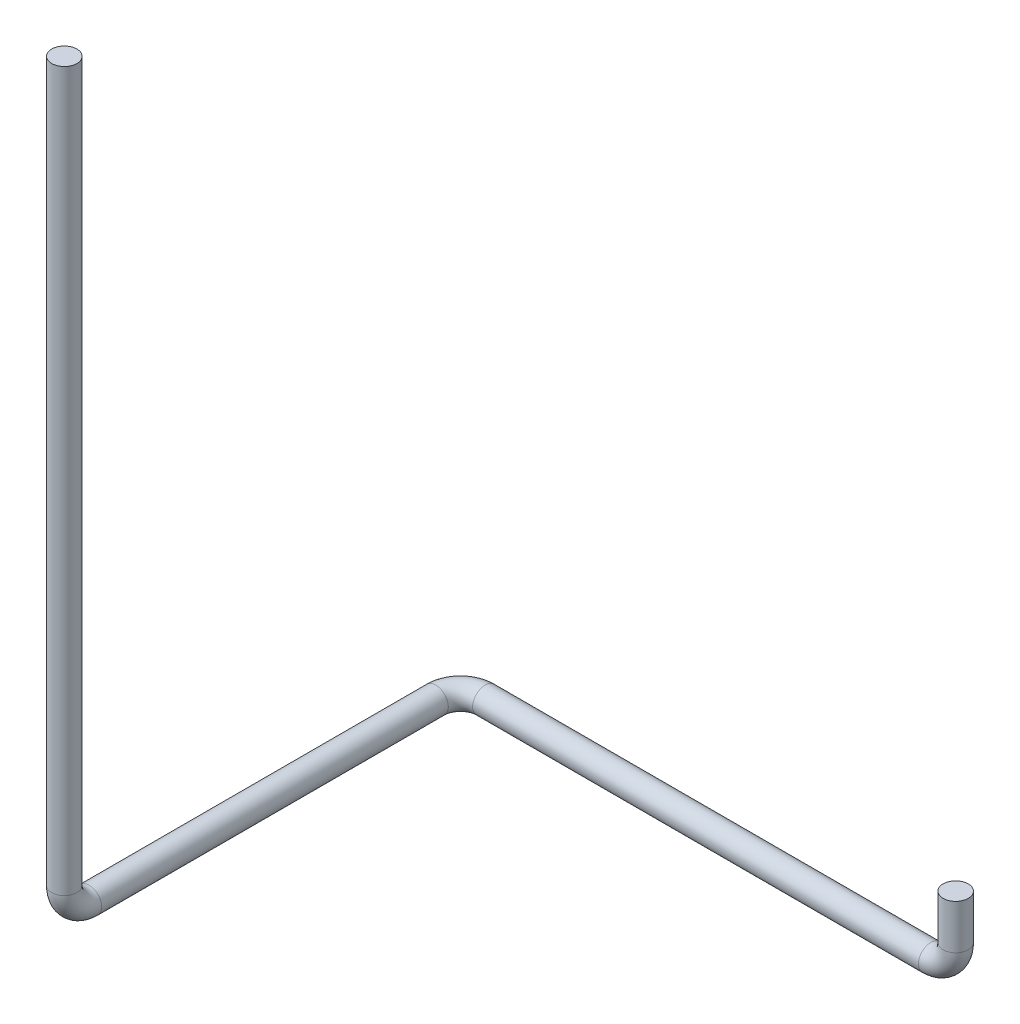
ISO-10303-21;
HEADER;
FILE_DESCRIPTION(('STEP AP214'),'2;1');
FILE_NAME('part.step','',(''),(''),'','','');
FILE_SCHEMA(('AUTOMOTIVE_DESIGN { 1 0 10303 214 1 1 1 1 }'));
ENDSEC;
DATA;
#1=APPLICATION_CONTEXT('core data for automotive mechanical design processes');
#2=APPLICATION_PROTOCOL_DEFINITION('international standard','automotive_design',2000,#1);
#3=PRODUCT_CONTEXT('',#1,'mechanical');
#4=PRODUCT('Part','Part','',(#3));
#5=PRODUCT_RELATED_PRODUCT_CATEGORY('part','',(#4));
#6=PRODUCT_DEFINITION_FORMATION('','',#4);
#7=PRODUCT_DEFINITION_CONTEXT('part definition',#1,'design');
#8=PRODUCT_DEFINITION('design','',#6,#7);
#9=PRODUCT_DEFINITION_SHAPE('','',#8);
#10=(LENGTH_UNIT() NAMED_UNIT(*) SI_UNIT(.MILLI.,.METRE.));
#11=(NAMED_UNIT(*) PLANE_ANGLE_UNIT() SI_UNIT($,.RADIAN.));
#12=(NAMED_UNIT(*) SI_UNIT($,.STERADIAN.) SOLID_ANGLE_UNIT());
#13=UNCERTAINTY_MEASURE_WITH_UNIT(LENGTH_MEASURE(1.E-05),#10,'distance_accuracy_value','');
#14=(GEOMETRIC_REPRESENTATION_CONTEXT(3) GLOBAL_UNCERTAINTY_ASSIGNED_CONTEXT((#13)) GLOBAL_UNIT_ASSIGNED_CONTEXT((#10,
#11,#12)) REPRESENTATION_CONTEXT('',''));
#15=CARTESIAN_POINT('',(0.,0.,0.));
#16=DIRECTION('',(0.,0.,1.));
#17=DIRECTION('',(1.,0.,0.));
#18=AXIS2_PLACEMENT_3D('',#15,#16,#17);
#19=CARTESIAN_POINT('',(0.,-20.,0.));
#20=DIRECTION('',(0.,1.,0.));
#21=DIRECTION('',(0.,0.,1.));
#22=AXIS2_PLACEMENT_3D('',#19,#20,#21);
#23=CYLINDRICAL_SURFACE('',#22,12.7);
#24=CARTESIAN_POINT('',(0.,0.,0.));
#25=DIRECTION('',(0.,1.,0.));
#26=DIRECTION('',(0.,0.,1.));
#27=AXIS2_PLACEMENT_3D('',#24,#25,#26);
#28=CIRCLE('',#27,12.7);
#29=CARTESIAN_POINT('',(0.,0.,12.7));
#30=VERTEX_POINT('',#29);
#31=EDGE_CURVE('E11',#30,#30,#28,.T.);
#32=ORIENTED_EDGE('',*,*,#31,.F.);
#33=EDGE_LOOP('',(#32));
#34=FACE_BOUND('',#33,.T.);
#35=CARTESIAN_POINT('',(0.,-45.,0.));
#36=DIRECTION('',(0.,-1.,0.));
#37=DIRECTION('',(0.,0.,-1.));
#38=AXIS2_PLACEMENT_3D('',#35,#36,#37);
#39=CIRCLE('',#38,12.7);
#40=CARTESIAN_POINT('',(12.7,-45.,0.));
#41=VERTEX_POINT('',#40);
#42=EDGE_CURVE('E63',#41,#41,#39,.T.);
#43=ORIENTED_EDGE('',*,*,#42,.F.);
#44=EDGE_LOOP('',(#43));
#45=FACE_BOUND('',#44,.T.);
#46=ADVANCED_FACE('F35',(#34,#45),#23,.T.);
#47=CARTESIAN_POINT('',(0.,0.,0.));
#48=DIRECTION('',(0.,1.,0.));
#49=DIRECTION('',(0.,0.,1.));
#50=AXIS2_PLACEMENT_3D('',#47,#48,#49);
#51=PLANE('',#50);
#52=ORIENTED_EDGE('',*,*,#31,.T.);
#53=EDGE_LOOP('',(#52));
#54=FACE_BOUND('',#53,.T.);
#55=ADVANCED_FACE('F70',(#54),#51,.T.);
#56=CARTESIAN_POINT('',(-500.,680.,400.));
#57=DIRECTION('',(0.,1.,0.));
#58=DIRECTION('',(-1.,0.,0.));
#59=AXIS2_PLACEMENT_3D('',#56,#57,#58);
#60=PLANE('',#59);
#61=CARTESIAN_POINT('',(-500.,680.,400.));
#62=DIRECTION('',(0.,1.,0.));
#63=DIRECTION('',(-1.,0.,0.));
#64=AXIS2_PLACEMENT_3D('',#61,#62,#63);
#65=CIRCLE('',#64,12.7);
#66=CARTESIAN_POINT('',(-512.7,680.,400.));
#67=VERTEX_POINT('',#66);
#68=EDGE_CURVE('E41',#67,#67,#65,.T.);
#69=ORIENTED_EDGE('',*,*,#68,.T.);
#70=EDGE_LOOP('',(#69));
#71=FACE_BOUND('',#70,.T.);
#72=ADVANCED_FACE('F45',(#71),#60,.T.);
#73=CARTESIAN_POINT('',(-25.,-45.,0.));
#74=DIRECTION('',(0.,0.,-1.));
#75=DIRECTION('',(-1.,0.,0.));
#76=AXIS2_PLACEMENT_3D('',#73,#74,#75);
#77=TOROIDAL_SURFACE('',#76,25.,12.7);
#78=CARTESIAN_POINT('',(-25.,-70.,0.));
#79=DIRECTION('',(-1.,0.,0.));
#80=DIRECTION('',(0.,0.,-1.));
#81=AXIS2_PLACEMENT_3D('',#78,#79,#80);
#82=CIRCLE('',#81,12.7);
#83=CARTESIAN_POINT('',(-25.,-82.7,0.));
#84=VERTEX_POINT('',#83);
#85=EDGE_CURVE('E60',#84,#84,#82,.T.);
#86=CARTESIAN_POINT('',(-25.,-45.,0.));
#87=DIRECTION('',(0.,0.,-1.));
#88=DIRECTION('',(-1.,0.,0.));
#89=AXIS2_PLACEMENT_3D('',#86,#87,#88);
#90=CIRCLE('',#89,37.7);
#91=EDGE_CURVE('',#41,#84,#90,.T.);
#92=ORIENTED_EDGE('',*,*,#42,.T.);
#93=ORIENTED_EDGE('',*,*,#85,.F.);
#94=ORIENTED_EDGE('',*,*,#91,.T.);
#95=ORIENTED_EDGE('',*,*,#91,.F.);
#96=EDGE_LOOP('',(#92,#94,#93,#95));
#97=FACE_BOUND('',#96,.T.);
#98=ADVANCED_FACE('F67',(#97),#77,.T.);
#99=CARTESIAN_POINT('',(-25.,-70.,0.));
#100=DIRECTION('',(-1.,0.,0.));
#101=DIRECTION('',(0.,0.,1.));
#102=AXIS2_PLACEMENT_3D('',#99,#100,#101);
#103=CYLINDRICAL_SURFACE('',#102,12.7);
#104=CARTESIAN_POINT('',(-475.,-70.,0.));
#105=DIRECTION('',(-1.,0.,0.));
#106=DIRECTION('',(0.,0.,-1.));
#107=AXIS2_PLACEMENT_3D('',#104,#105,#106);
#108=CIRCLE('',#107,12.7);
#109=CARTESIAN_POINT('',(-475.,-70.,-12.7));
#110=VERTEX_POINT('',#109);
#111=EDGE_CURVE('E57',#110,#110,#108,.T.);
#112=ORIENTED_EDGE('',*,*,#111,.F.);
#113=EDGE_LOOP('',(#112));
#114=FACE_BOUND('',#113,.T.);
#115=ORIENTED_EDGE('',*,*,#85,.T.);
#116=EDGE_LOOP('',(#115));
#117=FACE_BOUND('',#116,.T.);
#118=ADVANCED_FACE('F99',(#114,#117),#103,.T.);
#119=CARTESIAN_POINT('',(-475.,-70.,25.));
#120=DIRECTION('',(0.,1.,0.));
#121=DIRECTION('',(0.,0.,1.));
#122=AXIS2_PLACEMENT_3D('',#119,#120,#121);
#123=TOROIDAL_SURFACE('',#122,25.,12.7);
#124=CARTESIAN_POINT('',(-500.,-70.,25.));
#125=DIRECTION('',(0.,0.,1.));
#126=DIRECTION('',(-1.,0.,0.));
#127=AXIS2_PLACEMENT_3D('',#124,#125,#126);
#128=CIRCLE('',#127,12.7);
#129=CARTESIAN_POINT('',(-512.7,-70.,25.));
#130=VERTEX_POINT('',#129);
#131=EDGE_CURVE('E54',#130,#130,#128,.T.);
#132=CARTESIAN_POINT('',(-475.,-70.,25.));
#133=DIRECTION('',(0.,1.,0.));
#134=DIRECTION('',(0.,0.,1.));
#135=AXIS2_PLACEMENT_3D('',#132,#133,#134);
#136=CIRCLE('',#135,37.7);
#137=EDGE_CURVE('',#110,#130,#136,.T.);
#138=ORIENTED_EDGE('',*,*,#111,.T.);
#139=ORIENTED_EDGE('',*,*,#131,.F.);
#140=ORIENTED_EDGE('',*,*,#137,.T.);
#141=ORIENTED_EDGE('',*,*,#137,.F.);
#142=EDGE_LOOP('',(#138,#140,#139,#141));
#143=FACE_BOUND('',#142,.T.);
#144=ADVANCED_FACE('F95',(#143),#123,.T.);
#145=CARTESIAN_POINT('',(-500.,-70.,25.));
#146=DIRECTION('',(0.,0.,1.));
#147=DIRECTION('',(1.,0.,0.));
#148=AXIS2_PLACEMENT_3D('',#145,#146,#147);
#149=CYLINDRICAL_SURFACE('',#148,12.7);
#150=CARTESIAN_POINT('',(-500.,-70.,375.));
#151=DIRECTION('',(0.,0.,1.));
#152=DIRECTION('',(-1.,0.,0.));
#153=AXIS2_PLACEMENT_3D('',#150,#151,#152);
#154=CIRCLE('',#153,12.7);
#155=CARTESIAN_POINT('',(-500.,-82.7,375.));
#156=VERTEX_POINT('',#155);
#157=EDGE_CURVE('E49',#156,#156,#154,.T.);
#158=ORIENTED_EDGE('',*,*,#157,.F.);
#159=EDGE_LOOP('',(#158));
#160=FACE_BOUND('',#159,.T.);
#161=ORIENTED_EDGE('',*,*,#131,.T.);
#162=EDGE_LOOP('',(#161));
#163=FACE_BOUND('',#162,.T.);
#164=ADVANCED_FACE('F88',(#160,#163),#149,.T.);
#165=CARTESIAN_POINT('',(-500.,-45.,375.));
#166=DIRECTION('',(-1.,0.,0.));
#167=DIRECTION('',(0.,0.,1.));
#168=AXIS2_PLACEMENT_3D('',#165,#166,#167);
#169=TOROIDAL_SURFACE('',#168,25.,12.7);
#170=CARTESIAN_POINT('',(-500.,-45.,400.));
#171=DIRECTION('',(0.,1.,0.));
#172=DIRECTION('',(-1.,0.,0.));
#173=AXIS2_PLACEMENT_3D('',#170,#171,#172);
#174=CIRCLE('',#173,12.7);
#175=CARTESIAN_POINT('',(-500.,-45.,412.7));
#176=VERTEX_POINT('',#175);
#177=EDGE_CURVE('E47',#176,#176,#174,.T.);
#178=CARTESIAN_POINT('',(-500.,-45.,375.));
#179=DIRECTION('',(-1.,0.,0.));
#180=DIRECTION('',(0.,0.,1.));
#181=AXIS2_PLACEMENT_3D('',#178,#179,#180);
#182=CIRCLE('',#181,37.7);
#183=EDGE_CURVE('',#156,#176,#182,.T.);
#184=ORIENTED_EDGE('',*,*,#157,.T.);
#185=ORIENTED_EDGE('',*,*,#177,.F.);
#186=ORIENTED_EDGE('',*,*,#183,.T.);
#187=ORIENTED_EDGE('',*,*,#183,.F.);
#188=EDGE_LOOP('',(#184,#186,#185,#187));
#189=FACE_BOUND('',#188,.T.);
#190=ADVANCED_FACE('F83',(#189),#169,.T.);
#191=CARTESIAN_POINT('',(-500.,-45.,400.));
#192=DIRECTION('',(0.,1.,0.));
#193=DIRECTION('',(0.,0.,1.));
#194=AXIS2_PLACEMENT_3D('',#191,#192,#193);
#195=CYLINDRICAL_SURFACE('',#194,12.7);
#196=ORIENTED_EDGE('',*,*,#68,.F.);
#197=EDGE_LOOP('',(#196));
#198=FACE_BOUND('',#197,.T.);
#199=ORIENTED_EDGE('',*,*,#177,.T.);
#200=EDGE_LOOP('',(#199));
#201=FACE_BOUND('',#200,.T.);
#202=ADVANCED_FACE('F76',(#198,#201),#195,.T.);
#203=CLOSED_SHELL('',(#46,#55,#72,#98,#118,#144,#164,#190,#202));
#204=MANIFOLD_SOLID_BREP('B2',#203);
#205=ADVANCED_BREP_SHAPE_REPRESENTATION('',(#18,#204),#14);
#206=SHAPE_DEFINITION_REPRESENTATION(#9,#205);
ENDSEC;
END-ISO-10303-21;
